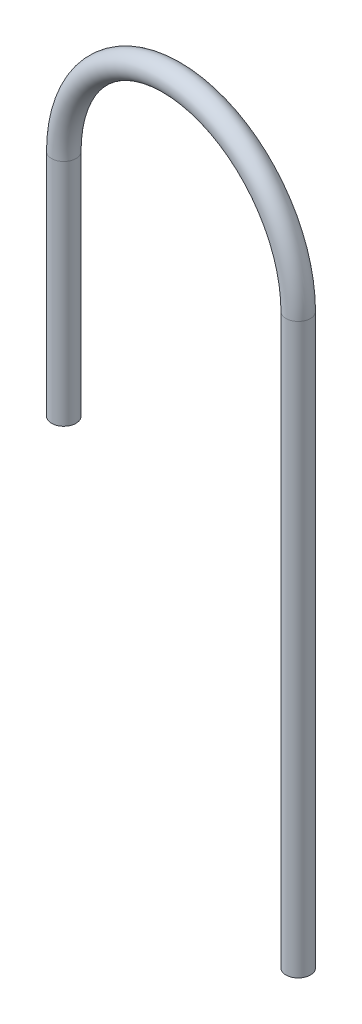
ISO-10303-21;
HEADER;
FILE_DESCRIPTION(('STEP AP214'),'2;1');
FILE_NAME('part.step','',(''),(''),'','','');
FILE_SCHEMA(('AUTOMOTIVE_DESIGN { 1 0 10303 214 1 1 1 1 }'));
ENDSEC;
DATA;
#1=APPLICATION_CONTEXT('core data for automotive mechanical design processes');
#2=APPLICATION_PROTOCOL_DEFINITION('international standard','automotive_design',2000,#1);
#3=PRODUCT_CONTEXT('',#1,'mechanical');
#4=PRODUCT('Part','Part','',(#3));
#5=PRODUCT_RELATED_PRODUCT_CATEGORY('part','',(#4));
#6=PRODUCT_DEFINITION_FORMATION('','',#4);
#7=PRODUCT_DEFINITION_CONTEXT('part definition',#1,'design');
#8=PRODUCT_DEFINITION('design','',#6,#7);
#9=PRODUCT_DEFINITION_SHAPE('','',#8);
#10=(LENGTH_UNIT() NAMED_UNIT(*) SI_UNIT(.MILLI.,.METRE.));
#11=(NAMED_UNIT(*) PLANE_ANGLE_UNIT() SI_UNIT($,.RADIAN.));
#12=(NAMED_UNIT(*) SI_UNIT($,.STERADIAN.) SOLID_ANGLE_UNIT());
#13=UNCERTAINTY_MEASURE_WITH_UNIT(LENGTH_MEASURE(1.E-05),#10,'distance_accuracy_value','');
#14=(GEOMETRIC_REPRESENTATION_CONTEXT(3) GLOBAL_UNCERTAINTY_ASSIGNED_CONTEXT((#13)) GLOBAL_UNIT_ASSIGNED_CONTEXT((#10,
#11,#12)) REPRESENTATION_CONTEXT('',''));
#15=CARTESIAN_POINT('',(0.,0.,0.));
#16=DIRECTION('',(0.,0.,1.));
#17=DIRECTION('',(1.,0.,0.));
#18=AXIS2_PLACEMENT_3D('',#15,#16,#17);
#19=CARTESIAN_POINT('',(14.,165.,-59.25));
#20=DIRECTION('',(0.,-1.,0.));
#21=DIRECTION('',(-0.165120370379967,0.,0.986273422173376));
#22=AXIS2_PLACEMENT_3D('',#19,#20,#21);
#23=PLANE('',#22);
#24=CARTESIAN_POINT('',(14.,165.,-59.25));
#25=DIRECTION('',(0.,-1.,0.));
#26=DIRECTION('',(1.,0.,0.));
#27=AXIS2_PLACEMENT_3D('',#24,#25,#26);
#28=CIRCLE('',#27,2.);
#29=CARTESIAN_POINT('',(16.,165.,-59.25));
#30=VERTEX_POINT('',#29);
#31=EDGE_CURVE('E66',#30,#30,#28,.T.);
#32=ORIENTED_EDGE('',*,*,#31,.F.);
#33=EDGE_LOOP('',(#32));
#34=FACE_BOUND('',#33,.T.);
#35=CARTESIAN_POINT('',(14.,165.,-59.25));
#36=DIRECTION('',(0.,-1.,0.));
#37=DIRECTION('',(-0.165120370379967,0.,0.986273422173376));
#38=AXIS2_PLACEMENT_3D('',#35,#36,#37);
#39=CIRCLE('',#38,3.);
#40=CARTESIAN_POINT('',(13.5046388888601,165.,-56.2911797334799));
#41=VERTEX_POINT('',#40);
#42=EDGE_CURVE('E57',#41,#41,#39,.T.);
#43=ORIENTED_EDGE('',*,*,#42,.T.);
#44=EDGE_LOOP('',(#43));
#45=FACE_BOUND('',#44,.T.);
#46=ADVANCED_FACE('F43',(#34,#45),#23,.T.);
#47=CARTESIAN_POINT('',(76.8149247014594,81.6500000000001,-54.0281491126505));
#48=DIRECTION('',(0.,1.,0.));
#49=DIRECTION('',(0.,0.,1.));
#50=AXIS2_PLACEMENT_3D('',#47,#48,#49);
#51=PLANE('',#50);
#52=CARTESIAN_POINT('',(76.8149247014594,81.6500000000001,-54.0281491126505));
#53=DIRECTION('',(0.,1.,0.));
#54=DIRECTION('',(0.,0.,1.));
#55=AXIS2_PLACEMENT_3D('',#52,#53,#54);
#56=CIRCLE('',#55,2.);
#57=CARTESIAN_POINT('',(76.8149247014594,81.6500000000001,-52.0281491126505));
#58=VERTEX_POINT('',#57);
#59=EDGE_CURVE('E62',#58,#58,#56,.T.);
#60=ORIENTED_EDGE('',*,*,#59,.T.);
#61=EDGE_LOOP('',(#60));
#62=FACE_BOUND('',#61,.T.);
#63=CARTESIAN_POINT('',(76.8149247014594,81.6500000000001,-54.0281491126505));
#64=DIRECTION('',(0.,1.,0.));
#65=DIRECTION('',(0.,0.,1.));
#66=AXIS2_PLACEMENT_3D('',#63,#64,#65);
#67=CIRCLE('',#66,3.);
#68=CARTESIAN_POINT('',(76.8149247014594,81.6500000000001,-51.0281491126505));
#69=VERTEX_POINT('',#68);
#70=EDGE_CURVE('E11',#69,#69,#67,.T.);
#71=ORIENTED_EDGE('',*,*,#70,.F.);
#72=EDGE_LOOP('',(#71));
#73=FACE_BOUND('',#72,.T.);
#74=ADVANCED_FACE('F86',(#62,#73),#51,.F.);
#75=CARTESIAN_POINT('',(14.,165.,-59.25));
#76=DIRECTION('',(0.,1.,0.));
#77=DIRECTION('',(0.,0.,1.));
#78=AXIS2_PLACEMENT_3D('',#75,#76,#77);
#79=CYLINDRICAL_SURFACE('',#78,3.);
#80=CARTESIAN_POINT('',(14.,221.325,-59.25));
#81=DIRECTION('',(0.,-1.,0.));
#82=DIRECTION('',(-0.165120370379967,0.,0.986273422173376));
#83=AXIS2_PLACEMENT_3D('',#80,#81,#82);
#84=CIRCLE('',#83,3.);
#85=CARTESIAN_POINT('',(11.0103126585243,221.325,-59.4985349074472));
#86=VERTEX_POINT('',#85);
#87=EDGE_CURVE('E53',#86,#86,#84,.T.);
#88=ORIENTED_EDGE('',*,*,#87,.T.);
#89=EDGE_LOOP('',(#88));
#90=FACE_BOUND('',#89,.T.);
#91=ORIENTED_EDGE('',*,*,#42,.F.);
#92=EDGE_LOOP('',(#91));
#93=FACE_BOUND('',#92,.T.);
#94=ADVANCED_FACE('F90',(#90,#93),#79,.T.);
#95=CARTESIAN_POINT('',(45.4074623507297,221.325,-56.6390745563252));
#96=DIRECTION('',(0.0828449691490796,0.,-0.996562447158575));
#97=DIRECTION('',(-0.996562447158575,0.,-0.0828449691490797));
#98=AXIS2_PLACEMENT_3D('',#95,#96,#97);
#99=TOROIDAL_SURFACE('',#98,31.5157995771157,3.);
#100=CARTESIAN_POINT('',(76.8149247014593,221.325,-54.0281491126504));
#101=DIRECTION('',(0.,1.,0.));
#102=DIRECTION('',(0.,0.,1.));
#103=AXIS2_PLACEMENT_3D('',#100,#101,#102);
#104=CIRCLE('',#103,3.);
#105=CARTESIAN_POINT('',(79.8046120429351,221.325,-53.7796142052031));
#106=VERTEX_POINT('',#105);
#107=EDGE_CURVE('E49',#106,#106,#104,.T.);
#108=CARTESIAN_POINT('',(45.4074623507297,221.325,-56.6390745563252));
#109=DIRECTION('',(0.0828449691490796,0.,-0.996562447158575));
#110=DIRECTION('',(-0.996562447158575,0.,-0.0828449691490797));
#111=AXIS2_PLACEMENT_3D('',#108,#109,#110);
#112=CIRCLE('',#111,34.5157995771158);
#113=EDGE_CURVE('',#86,#106,#112,.T.);
#114=ORIENTED_EDGE('',*,*,#87,.F.);
#115=ORIENTED_EDGE('',*,*,#107,.T.);
#116=ORIENTED_EDGE('',*,*,#113,.T.);
#117=ORIENTED_EDGE('',*,*,#113,.F.);
#118=EDGE_LOOP('',(#114,#116,#115,#117));
#119=FACE_BOUND('',#118,.T.);
#120=ADVANCED_FACE('F92',(#119),#99,.T.);
#121=CARTESIAN_POINT('',(76.8149247014594,221.325,-54.0281491126504));
#122=DIRECTION('',(0.,-1.,0.));
#123=DIRECTION('',(0.,0.,-1.));
#124=AXIS2_PLACEMENT_3D('',#121,#122,#123);
#125=CYLINDRICAL_SURFACE('',#124,3.);
#126=ORIENTED_EDGE('',*,*,#70,.T.);
#127=EDGE_LOOP('',(#126));
#128=FACE_BOUND('',#127,.T.);
#129=ORIENTED_EDGE('',*,*,#107,.F.);
#130=EDGE_LOOP('',(#129));
#131=FACE_BOUND('',#130,.T.);
#132=ADVANCED_FACE('F80',(#128,#131),#125,.T.);
#133=CARTESIAN_POINT('',(14.,165.,-59.25));
#134=DIRECTION('',(0.,1.,0.));
#135=DIRECTION('',(0.,0.,1.));
#136=AXIS2_PLACEMENT_3D('',#133,#134,#135);
#137=CYLINDRICAL_SURFACE('',#136,2.);
#138=CARTESIAN_POINT('',(14.,221.325,-59.25));
#139=DIRECTION('',(0.,1.,0.));
#140=DIRECTION('',(0.,0.,1.));
#141=AXIS2_PLACEMENT_3D('',#138,#139,#140);
#142=CIRCLE('',#141,2.);
#143=CARTESIAN_POINT('',(12.0068751056829,221.325,-59.4156899382982));
#144=VERTEX_POINT('',#143);
#145=EDGE_CURVE('E69',#144,#144,#142,.F.);
#146=ORIENTED_EDGE('',*,*,#145,.F.);
#147=EDGE_LOOP('',(#146));
#148=FACE_BOUND('',#147,.T.);
#149=ORIENTED_EDGE('',*,*,#31,.T.);
#150=EDGE_LOOP('',(#149));
#151=FACE_BOUND('',#150,.T.);
#152=ADVANCED_FACE('F77',(#148,#151),#137,.F.);
#153=CARTESIAN_POINT('',(45.4074623507297,221.325,-56.6390745563252));
#154=DIRECTION('',(0.0828449691490796,0.,-0.996562447158575));
#155=DIRECTION('',(-0.996562447158575,0.,-0.0828449691490797));
#156=AXIS2_PLACEMENT_3D('',#153,#154,#155);
#157=TOROIDAL_SURFACE('',#156,31.5157995771157,2.);
#158=CARTESIAN_POINT('',(76.8149247014593,221.325,-54.0281491126505));
#159=DIRECTION('',(0.,1.,0.));
#160=DIRECTION('',(-1.,0.,0.));
#161=AXIS2_PLACEMENT_3D('',#158,#159,#160);
#162=CIRCLE('',#161,2.);
#163=CARTESIAN_POINT('',(78.8080495957765,221.325,-53.8624591743523));
#164=VERTEX_POINT('',#163);
#165=EDGE_CURVE('E65',#164,#164,#162,.T.);
#166=CARTESIAN_POINT('',(45.4074623507297,221.325,-56.6390745563252));
#167=DIRECTION('',(0.0828449691490796,0.,-0.996562447158575));
#168=DIRECTION('',(-0.996562447158575,0.,-0.0828449691490797));
#169=AXIS2_PLACEMENT_3D('',#166,#167,#168);
#170=CIRCLE('',#169,33.5157995771158);
#171=EDGE_CURVE('',#144,#164,#170,.T.);
#172=ORIENTED_EDGE('',*,*,#145,.T.);
#173=ORIENTED_EDGE('',*,*,#165,.F.);
#174=ORIENTED_EDGE('',*,*,#171,.T.);
#175=ORIENTED_EDGE('',*,*,#171,.F.);
#176=EDGE_LOOP('',(#172,#174,#173,#175));
#177=FACE_BOUND('',#176,.T.);
#178=ADVANCED_FACE('F75',(#177),#157,.F.);
#179=CARTESIAN_POINT('',(76.8149247014594,221.325,-54.0281491126504));
#180=DIRECTION('',(0.,-1.,0.));
#181=DIRECTION('',(0.,0.,-1.));
#182=AXIS2_PLACEMENT_3D('',#179,#180,#181);
#183=CYLINDRICAL_SURFACE('',#182,2.);
#184=ORIENTED_EDGE('',*,*,#59,.F.);
#185=EDGE_LOOP('',(#184));
#186=FACE_BOUND('',#185,.T.);
#187=ORIENTED_EDGE('',*,*,#165,.T.);
#188=EDGE_LOOP('',(#187));
#189=FACE_BOUND('',#188,.T.);
#190=ADVANCED_FACE('F87',(#186,#189),#183,.F.);
#191=CLOSED_SHELL('',(#46,#74,#94,#120,#132,#152,#178,#190));
#192=MANIFOLD_SOLID_BREP('B2',#191);
#193=ADVANCED_BREP_SHAPE_REPRESENTATION('',(#18,#192),#14);
#194=SHAPE_DEFINITION_REPRESENTATION(#9,#193);
ENDSEC;
END-ISO-10303-21;
